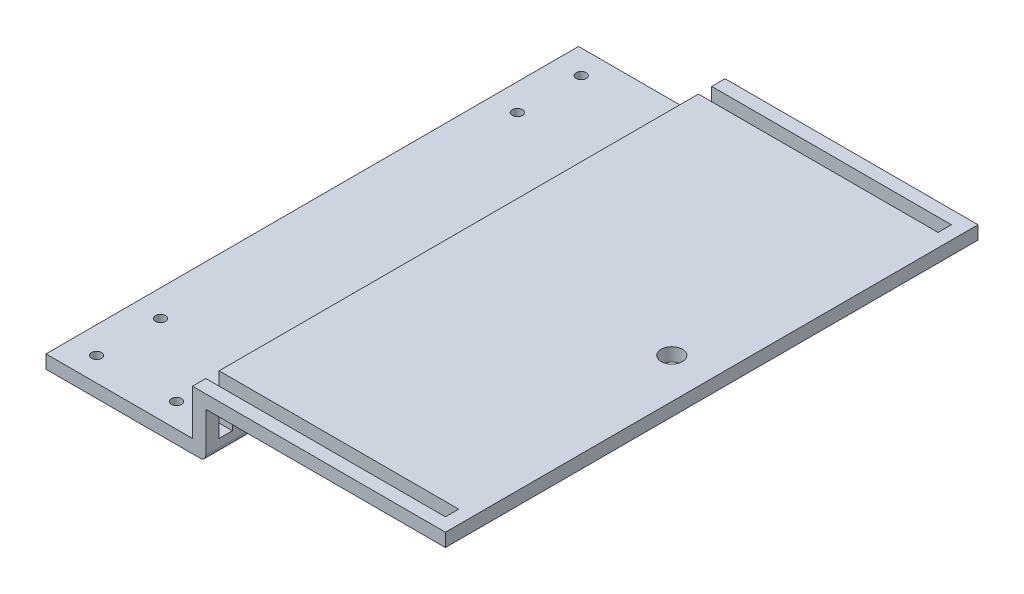
ISO-10303-21;
HEADER;
FILE_DESCRIPTION(('STEP AP214'),'2;1');
FILE_NAME('part.step','',(''),(''),'','','');
FILE_SCHEMA(('AUTOMOTIVE_DESIGN { 1 0 10303 214 1 1 1 1 }'));
ENDSEC;
DATA;
#1=APPLICATION_CONTEXT('core data for automotive mechanical design processes');
#2=APPLICATION_PROTOCOL_DEFINITION('international standard','automotive_design',2000,#1);
#3=PRODUCT_CONTEXT('',#1,'mechanical');
#4=PRODUCT('Part','Part','',(#3));
#5=PRODUCT_RELATED_PRODUCT_CATEGORY('part','',(#4));
#6=PRODUCT_DEFINITION_FORMATION('','',#4);
#7=PRODUCT_DEFINITION_CONTEXT('part definition',#1,'design');
#8=PRODUCT_DEFINITION('design','',#6,#7);
#9=PRODUCT_DEFINITION_SHAPE('','',#8);
#10=(LENGTH_UNIT() NAMED_UNIT(*) SI_UNIT(.MILLI.,.METRE.));
#11=(NAMED_UNIT(*) PLANE_ANGLE_UNIT() SI_UNIT($,.RADIAN.));
#12=(NAMED_UNIT(*) SI_UNIT($,.STERADIAN.) SOLID_ANGLE_UNIT());
#13=UNCERTAINTY_MEASURE_WITH_UNIT(LENGTH_MEASURE(1.E-05),#10,'distance_accuracy_value','');
#14=(GEOMETRIC_REPRESENTATION_CONTEXT(3) GLOBAL_UNCERTAINTY_ASSIGNED_CONTEXT((#13)) GLOBAL_UNIT_ASSIGNED_CONTEXT((#10,
#11,#12)) REPRESENTATION_CONTEXT('',''));
#15=CARTESIAN_POINT('',(0.,0.,0.));
#16=DIRECTION('',(0.,0.,1.));
#17=DIRECTION('',(1.,0.,0.));
#18=AXIS2_PLACEMENT_3D('',#15,#16,#17);
#19=CARTESIAN_POINT('',(-75.,100.,-100.));
#20=DIRECTION('',(0.,0.,1.));
#21=DIRECTION('',(1.,0.,0.));
#22=AXIS2_PLACEMENT_3D('',#19,#20,#21);
#23=PLANE('',#22);
#24=DIRECTION('',(0.,1.,0.));
#25=VECTOR('',#24,1.);
#26=CARTESIAN_POINT('',(-15.,0.,-100.));
#27=LINE('',#26,#25);
#28=CARTESIAN_POINT('',(-15.,2.,-100.));
#29=VERTEX_POINT('',#28);
#30=CARTESIAN_POINT('',(-15.,17.,-100.));
#31=VERTEX_POINT('',#30);
#32=EDGE_CURVE('E546',#29,#31,#27,.T.);
#33=ORIENTED_EDGE('',*,*,#32,.F.);
#34=CARTESIAN_POINT('',(-17.,2.,-100.));
#35=DIRECTION('',(0.,0.,1.));
#36=DIRECTION('',(1.,0.,0.));
#37=AXIS2_PLACEMENT_3D('',#34,#35,#36);
#38=CIRCLE('',#37,2.);
#39=CARTESIAN_POINT('',(-17.,0.,-100.));
#40=VERTEX_POINT('',#39);
#41=EDGE_CURVE('E195',#29,#40,#38,.F.);
#42=ORIENTED_EDGE('',*,*,#41,.T.);
#43=DIRECTION('',(-1.,0.,0.));
#44=VECTOR('',#43,1.);
#45=CARTESIAN_POINT('',(-75.,0.,-100.));
#46=LINE('',#45,#44);
#47=CARTESIAN_POINT('',(-75.,0.,-100.));
#48=VERTEX_POINT('',#47);
#49=EDGE_CURVE('E606',#40,#48,#46,.T.);
#50=ORIENTED_EDGE('',*,*,#49,.T.);
#51=DIRECTION('',(0.,-1.,0.));
#52=VECTOR('',#51,1.);
#53=CARTESIAN_POINT('',(-75.,100.,-100.));
#54=LINE('',#53,#52);
#55=CARTESIAN_POINT('',(-75.,5.,-100.));
#56=VERTEX_POINT('',#55);
#57=EDGE_CURVE('E360',#56,#48,#54,.T.);
#58=ORIENTED_EDGE('',*,*,#57,.F.);
#59=DIRECTION('',(-1.,0.,0.));
#60=VECTOR('',#59,1.);
#61=CARTESIAN_POINT('',(-75.,5.,-100.));
#62=LINE('',#61,#60);
#63=CARTESIAN_POINT('',(-20.,5.,-100.));
#64=VERTEX_POINT('',#63);
#65=EDGE_CURVE('E383',#64,#56,#62,.T.);
#66=ORIENTED_EDGE('',*,*,#65,.F.);
#67=DIRECTION('',(0.,1.,0.));
#68=VECTOR('',#67,1.);
#69=CARTESIAN_POINT('',(-20.,0.,-100.));
#70=LINE('',#69,#68);
#71=CARTESIAN_POINT('',(-20.,22.,-100.));
#72=VERTEX_POINT('',#71);
#73=EDGE_CURVE('E333',#64,#72,#70,.T.);
#74=ORIENTED_EDGE('',*,*,#73,.T.);
#75=DIRECTION('',(-1.,0.,0.));
#76=VECTOR('',#75,1.);
#77=CARTESIAN_POINT('',(0.,22.,-100.));
#78=LINE('',#77,#76);
#79=CARTESIAN_POINT('',(75.,22.,-100.));
#80=VERTEX_POINT('',#79);
#81=EDGE_CURVE('E321',#80,#72,#78,.T.);
#82=ORIENTED_EDGE('',*,*,#81,.F.);
#83=DIRECTION('',(0.,-1.,0.));
#84=VECTOR('',#83,1.);
#85=CARTESIAN_POINT('',(75.,100.,-100.));
#86=LINE('',#85,#84);
#87=CARTESIAN_POINT('',(75.,17.,-100.));
#88=VERTEX_POINT('',#87);
#89=EDGE_CURVE('E329',#80,#88,#86,.T.);
#90=ORIENTED_EDGE('',*,*,#89,.T.);
#91=DIRECTION('',(-1.,0.,0.));
#92=VECTOR('',#91,1.);
#93=CARTESIAN_POINT('',(0.,17.,-100.));
#94=LINE('',#93,#92);
#95=EDGE_CURVE('E340',#88,#31,#94,.T.);
#96=ORIENTED_EDGE('',*,*,#95,.T.);
#97=EDGE_LOOP('',(#33,#42,#50,#58,#66,#74,#82,#90,#96));
#98=FACE_BOUND('',#97,.T.);
#99=ADVANCED_FACE('F168',(#98),#23,.F.);
#100=CARTESIAN_POINT('',(70.,100.,-100.));
#101=DIRECTION('',(-1.,0.,0.));
#102=DIRECTION('',(0.,0.,1.));
#103=AXIS2_PLACEMENT_3D('',#100,#101,#102);
#104=PLANE('',#103);
#105=DIRECTION('',(0.,1.,0.));
#106=VECTOR('',#105,1.);
#107=CARTESIAN_POINT('',(70.,-135.089257261219,95.));
#108=LINE('',#107,#106);
#109=CARTESIAN_POINT('',(70.,16.9999999999999,95.));
#110=VERTEX_POINT('',#109);
#111=CARTESIAN_POINT('',(70.,22.,95.));
#112=VERTEX_POINT('',#111);
#113=EDGE_CURVE('E497',#110,#112,#108,.T.);
#114=ORIENTED_EDGE('',*,*,#113,.T.);
#115=DIRECTION('',(0.,0.,-1.));
#116=VECTOR('',#115,1.);
#117=CARTESIAN_POINT('',(70.,22.,-100.));
#118=LINE('',#117,#116);
#119=CARTESIAN_POINT('',(70.,22.,90.));
#120=VERTEX_POINT('',#119);
#121=EDGE_CURVE('E673',#112,#120,#118,.T.);
#122=ORIENTED_EDGE('',*,*,#121,.T.);
#123=DIRECTION('',(0.,1.,0.));
#124=VECTOR('',#123,1.);
#125=CARTESIAN_POINT('',(70.,-135.089257261219,90.));
#126=LINE('',#125,#124);
#127=CARTESIAN_POINT('',(70.,16.9999999999999,90.));
#128=VERTEX_POINT('',#127);
#129=EDGE_CURVE('E506',#128,#120,#126,.T.);
#130=ORIENTED_EDGE('',*,*,#129,.F.);
#131=DIRECTION('',(0.,0.,-1.));
#132=VECTOR('',#131,1.);
#133=CARTESIAN_POINT('',(70.,17.,-100.));
#134=LINE('',#133,#132);
#135=EDGE_CURVE('E415',#110,#128,#134,.T.);
#136=ORIENTED_EDGE('',*,*,#135,.F.);
#137=EDGE_LOOP('',(#114,#122,#130,#136));
#138=FACE_BOUND('',#137,.T.);
#139=ADVANCED_FACE('F714',(#138),#104,.T.);
#140=DIRECTION('',(0.,1.,0.));
#141=VECTOR('',#140,1.);
#142=CARTESIAN_POINT('',(70.,-135.089257261219,-90.));
#143=LINE('',#142,#141);
#144=CARTESIAN_POINT('',(70.,16.9999999999999,-90.));
#145=VERTEX_POINT('',#144);
#146=CARTESIAN_POINT('',(70.,22.,-90.));
#147=VERTEX_POINT('',#146);
#148=EDGE_CURVE('E656',#145,#147,#143,.T.);
#149=ORIENTED_EDGE('',*,*,#148,.T.);
#150=CARTESIAN_POINT('',(70.,22.,-95.));
#151=VERTEX_POINT('',#150);
#152=EDGE_CURVE('E347',#147,#151,#118,.T.);
#153=ORIENTED_EDGE('',*,*,#152,.T.);
#154=DIRECTION('',(0.,1.,0.));
#155=VECTOR('',#154,1.);
#156=CARTESIAN_POINT('',(70.,-135.089257261219,-95.));
#157=LINE('',#156,#155);
#158=CARTESIAN_POINT('',(70.,16.9999999999999,-95.));
#159=VERTEX_POINT('',#158);
#160=EDGE_CURVE('E659',#159,#151,#157,.T.);
#161=ORIENTED_EDGE('',*,*,#160,.F.);
#162=DIRECTION('',(0.,0.,1.));
#163=VECTOR('',#162,1.);
#164=CARTESIAN_POINT('',(70.,17.,-100.));
#165=LINE('',#164,#163);
#166=EDGE_CURVE('E429',#159,#145,#165,.T.);
#167=ORIENTED_EDGE('',*,*,#166,.T.);
#168=EDGE_LOOP('',(#149,#153,#161,#167));
#169=FACE_BOUND('',#168,.T.);
#170=ADVANCED_FACE('F679',(#169),#104,.T.);
#171=CARTESIAN_POINT('',(75.,100.,-100.));
#172=DIRECTION('',(-1.,0.,0.));
#173=DIRECTION('',(0.,0.,1.));
#174=AXIS2_PLACEMENT_3D('',#171,#172,#173);
#175=PLANE('',#174);
#176=DIRECTION('',(0.,0.,-1.));
#177=VECTOR('',#176,1.);
#178=CARTESIAN_POINT('',(75.,22.,-100.));
#179=LINE('',#178,#177);
#180=CARTESIAN_POINT('',(75.,22.,100.));
#181=VERTEX_POINT('',#180);
#182=EDGE_CURVE('E337',#181,#80,#179,.T.);
#183=ORIENTED_EDGE('',*,*,#182,.F.);
#184=DIRECTION('',(0.,-1.,0.));
#185=VECTOR('',#184,1.);
#186=CARTESIAN_POINT('',(75.,100.,100.));
#187=LINE('',#186,#185);
#188=CARTESIAN_POINT('',(75.,17.,100.));
#189=VERTEX_POINT('',#188);
#190=EDGE_CURVE('E619',#181,#189,#187,.T.);
#191=ORIENTED_EDGE('',*,*,#190,.T.);
#192=DIRECTION('',(0.,0.,-1.));
#193=VECTOR('',#192,1.);
#194=CARTESIAN_POINT('',(75.,17.,-100.));
#195=LINE('',#194,#193);
#196=EDGE_CURVE('E353',#189,#88,#195,.T.);
#197=ORIENTED_EDGE('',*,*,#196,.T.);
#198=ORIENTED_EDGE('',*,*,#89,.F.);
#199=EDGE_LOOP('',(#183,#191,#197,#198));
#200=FACE_BOUND('',#199,.T.);
#201=ADVANCED_FACE('F355',(#200),#175,.F.);
#202=CARTESIAN_POINT('',(-75.,100.,-100.));
#203=DIRECTION('',(1.,0.,0.));
#204=DIRECTION('',(0.,0.,-1.));
#205=AXIS2_PLACEMENT_3D('',#202,#203,#204);
#206=PLANE('',#205);
#207=DIRECTION('',(0.,0.,1.));
#208=VECTOR('',#207,1.);
#209=CARTESIAN_POINT('',(-75.,5.,-100.));
#210=LINE('',#209,#208);
#211=CARTESIAN_POINT('',(-75.,5.,100.));
#212=VERTEX_POINT('',#211);
#213=EDGE_CURVE('E664',#56,#212,#210,.T.);
#214=ORIENTED_EDGE('',*,*,#213,.F.);
#215=ORIENTED_EDGE('',*,*,#57,.T.);
#216=DIRECTION('',(0.,0.,1.));
#217=VECTOR('',#216,1.);
#218=CARTESIAN_POINT('',(-75.,0.,-100.));
#219=LINE('',#218,#217);
#220=CARTESIAN_POINT('',(-75.,0.,100.));
#221=VERTEX_POINT('',#220);
#222=EDGE_CURVE('E612',#48,#221,#219,.T.);
#223=ORIENTED_EDGE('',*,*,#222,.T.);
#224=DIRECTION('',(0.,-1.,0.));
#225=VECTOR('',#224,1.);
#226=CARTESIAN_POINT('',(-75.,100.,100.));
#227=LINE('',#226,#225);
#228=EDGE_CURVE('E361',#212,#221,#227,.T.);
#229=ORIENTED_EDGE('',*,*,#228,.F.);
#230=EDGE_LOOP('',(#214,#215,#223,#229));
#231=FACE_BOUND('',#230,.T.);
#232=ADVANCED_FACE('F633',(#231),#206,.F.);
#233=CARTESIAN_POINT('',(-15.,0.,-100.));
#234=DIRECTION('',(1.,0.,0.));
#235=DIRECTION('',(0.,0.,-1.));
#236=AXIS2_PLACEMENT_3D('',#233,#234,#235);
#237=PLANE('',#236);
#238=DIRECTION('',(0.,1.,0.));
#239=VECTOR('',#238,1.);
#240=CARTESIAN_POINT('',(-15.,0.,-90.));
#241=LINE('',#240,#239);
#242=CARTESIAN_POINT('',(-15.,5.,-90.));
#243=VERTEX_POINT('',#242);
#244=CARTESIAN_POINT('',(-15.,15.,-90.));
#245=VERTEX_POINT('',#244);
#246=EDGE_CURVE('E488',#243,#245,#241,.T.);
#247=ORIENTED_EDGE('',*,*,#246,.T.);
#248=DIRECTION('',(0.,0.,1.));
#249=VECTOR('',#248,1.);
#250=CARTESIAN_POINT('',(-15.,15.,-100.));
#251=LINE('',#250,#249);
#252=CARTESIAN_POINT('',(-15.,15.,90.));
#253=VERTEX_POINT('',#252);
#254=EDGE_CURVE('E443',#245,#253,#251,.T.);
#255=ORIENTED_EDGE('',*,*,#254,.T.);
#256=DIRECTION('',(0.,1.,0.));
#257=VECTOR('',#256,1.);
#258=CARTESIAN_POINT('',(-15.,0.,90.));
#259=LINE('',#258,#257);
#260=CARTESIAN_POINT('',(-15.,5.,90.));
#261=VERTEX_POINT('',#260);
#262=EDGE_CURVE('E475',#261,#253,#259,.T.);
#263=ORIENTED_EDGE('',*,*,#262,.F.);
#264=DIRECTION('',(0.,0.,1.));
#265=VECTOR('',#264,1.);
#266=CARTESIAN_POINT('',(-15.,5.,-100.));
#267=LINE('',#266,#265);
#268=CARTESIAN_POINT('',(-15.,5.,95.));
#269=VERTEX_POINT('',#268);
#270=EDGE_CURVE('E417',#261,#269,#267,.T.);
#271=ORIENTED_EDGE('',*,*,#270,.T.);
#272=DIRECTION('',(0.,1.,0.));
#273=VECTOR('',#272,1.);
#274=CARTESIAN_POINT('',(-15.,0.,95.));
#275=LINE('',#274,#273);
#276=CARTESIAN_POINT('',(-15.,17.,95.));
#277=VERTEX_POINT('',#276);
#278=EDGE_CURVE('E527',#269,#277,#275,.T.);
#279=ORIENTED_EDGE('',*,*,#278,.T.);
#280=DIRECTION('',(0.,0.,1.));
#281=VECTOR('',#280,1.);
#282=CARTESIAN_POINT('',(-15.,17.,-100.));
#283=LINE('',#282,#281);
#284=CARTESIAN_POINT('',(-15.,17.,100.));
#285=VERTEX_POINT('',#284);
#286=EDGE_CURVE('E338',#277,#285,#283,.T.);
#287=ORIENTED_EDGE('',*,*,#286,.T.);
#288=DIRECTION('',(0.,1.,0.));
#289=VECTOR('',#288,1.);
#290=CARTESIAN_POINT('',(-15.,0.,100.));
#291=LINE('',#290,#289);
#292=CARTESIAN_POINT('',(-15.,2.,100.));
#293=VERTEX_POINT('',#292);
#294=EDGE_CURVE('E558',#293,#285,#291,.T.);
#295=ORIENTED_EDGE('',*,*,#294,.F.);
#296=DIRECTION('',(0.,0.,1.));
#297=VECTOR('',#296,1.);
#298=CARTESIAN_POINT('',(-15.,2.,-100.));
#299=LINE('',#298,#297);
#300=EDGE_CURVE('E438',#293,#29,#299,.F.);
#301=ORIENTED_EDGE('',*,*,#300,.T.);
#302=ORIENTED_EDGE('',*,*,#32,.T.);
#303=CARTESIAN_POINT('',(-15.,17.,-95.));
#304=VERTEX_POINT('',#303);
#305=EDGE_CURVE('E571',#31,#304,#283,.T.);
#306=ORIENTED_EDGE('',*,*,#305,.T.);
#307=DIRECTION('',(0.,1.,0.));
#308=VECTOR('',#307,1.);
#309=CARTESIAN_POINT('',(-15.,0.,-95.));
#310=LINE('',#309,#308);
#311=CARTESIAN_POINT('',(-15.,5.,-95.));
#312=VERTEX_POINT('',#311);
#313=EDGE_CURVE('E641',#312,#304,#310,.T.);
#314=ORIENTED_EDGE('',*,*,#313,.F.);
#315=DIRECTION('',(0.,0.,1.));
#316=VECTOR('',#315,1.);
#317=CARTESIAN_POINT('',(-15.,5.,-100.));
#318=LINE('',#317,#316);
#319=EDGE_CURVE('E492',#312,#243,#318,.T.);
#320=ORIENTED_EDGE('',*,*,#319,.T.);
#321=EDGE_LOOP('',(#247,#255,#263,#271,#279,#287,#295,#301,#302,#306,#314,#320));
#322=FACE_BOUND('',#321,.T.);
#323=ADVANCED_FACE('F495',(#322),#237,.T.);
#324=CARTESIAN_POINT('',(0.,17.,-100.));
#325=DIRECTION('',(0.,1.,0.));
#326=DIRECTION('',(-1.,0.,0.));
#327=AXIS2_PLACEMENT_3D('',#324,#325,#326);
#328=PLANE('',#327);
#329=CARTESIAN_POINT('',(60.,17.,0.));
#330=DIRECTION('',(0.,-1.,0.));
#331=DIRECTION('',(1.,0.,0.));
#332=AXIS2_PLACEMENT_3D('',#329,#330,#331);
#333=CIRCLE('',#332,4.00000000000001);
#334=CARTESIAN_POINT('',(64.,17.,0.));
#335=VERTEX_POINT('',#334);
#336=EDGE_CURVE('E540',#335,#335,#333,.T.);
#337=ORIENTED_EDGE('',*,*,#336,.F.);
#338=EDGE_LOOP('',(#337));
#339=FACE_BOUND('',#338,.T.);
#340=DIRECTION('',(-1.,0.,0.));
#341=VECTOR('',#340,1.);
#342=CARTESIAN_POINT('',(0.,17.,90.));
#343=LINE('',#342,#341);
#344=CARTESIAN_POINT('',(-13.,17.,90.));
#345=VERTEX_POINT('',#344);
#346=EDGE_CURVE('E406',#128,#345,#343,.T.);
#347=ORIENTED_EDGE('',*,*,#346,.T.);
#348=DIRECTION('',(0.,0.,1.));
#349=VECTOR('',#348,1.);
#350=CARTESIAN_POINT('',(-13.,17.,-100.));
#351=LINE('',#350,#349);
#352=CARTESIAN_POINT('',(-13.,17.,-90.));
#353=VERTEX_POINT('',#352);
#354=EDGE_CURVE('E450',#345,#353,#351,.F.);
#355=ORIENTED_EDGE('',*,*,#354,.T.);
#356=DIRECTION('',(-1.,0.,0.));
#357=VECTOR('',#356,1.);
#358=CARTESIAN_POINT('',(0.,17.,-90.));
#359=LINE('',#358,#357);
#360=EDGE_CURVE('E489',#145,#353,#359,.T.);
#361=ORIENTED_EDGE('',*,*,#360,.F.);
#362=ORIENTED_EDGE('',*,*,#166,.F.);
#363=DIRECTION('',(-1.,0.,0.));
#364=VECTOR('',#363,1.);
#365=CARTESIAN_POINT('',(0.,17.,-95.));
#366=LINE('',#365,#364);
#367=EDGE_CURVE('E637',#159,#304,#366,.T.);
#368=ORIENTED_EDGE('',*,*,#367,.T.);
#369=ORIENTED_EDGE('',*,*,#305,.F.);
#370=ORIENTED_EDGE('',*,*,#95,.F.);
#371=ORIENTED_EDGE('',*,*,#196,.F.);
#372=DIRECTION('',(-1.,0.,0.));
#373=VECTOR('',#372,1.);
#374=CARTESIAN_POINT('',(0.,17.,100.));
#375=LINE('',#374,#373);
#376=EDGE_CURVE('E560',#189,#285,#375,.T.);
#377=ORIENTED_EDGE('',*,*,#376,.T.);
#378=ORIENTED_EDGE('',*,*,#286,.F.);
#379=DIRECTION('',(-1.,0.,0.));
#380=VECTOR('',#379,1.);
#381=CARTESIAN_POINT('',(0.,17.,95.));
#382=LINE('',#381,#380);
#383=EDGE_CURVE('E416',#110,#277,#382,.T.);
#384=ORIENTED_EDGE('',*,*,#383,.F.);
#385=ORIENTED_EDGE('',*,*,#135,.T.);
#386=EDGE_LOOP('',(#347,#355,#361,#362,#368,#369,#370,#371,#377,#378,#384,#385));
#387=FACE_BOUND('',#386,.T.);
#388=ADVANCED_FACE('F479',(#339,#387),#328,.F.);
#389=CARTESIAN_POINT('',(-20.,0.,-100.));
#390=DIRECTION('',(1.,0.,0.));
#391=DIRECTION('',(0.,0.,-1.));
#392=AXIS2_PLACEMENT_3D('',#389,#390,#391);
#393=PLANE('',#392);
#394=DIRECTION('',(0.,1.,0.));
#395=VECTOR('',#394,1.);
#396=CARTESIAN_POINT('',(-20.,0.,-90.));
#397=LINE('',#396,#395);
#398=CARTESIAN_POINT('',(-20.,7.,-90.));
#399=VERTEX_POINT('',#398);
#400=CARTESIAN_POINT('',(-20.,22.,-90.));
#401=VERTEX_POINT('',#400);
#402=EDGE_CURVE('E430',#399,#401,#397,.T.);
#403=ORIENTED_EDGE('',*,*,#402,.F.);
#404=DIRECTION('',(0.,0.,-1.));
#405=VECTOR('',#404,1.);
#406=CARTESIAN_POINT('',(-20.,7.,-100.));
#407=LINE('',#406,#405);
#408=CARTESIAN_POINT('',(-20.,7.,90.));
#409=VERTEX_POINT('',#408);
#410=EDGE_CURVE('E440',#399,#409,#407,.F.);
#411=ORIENTED_EDGE('',*,*,#410,.T.);
#412=DIRECTION('',(0.,1.,0.));
#413=VECTOR('',#412,1.);
#414=CARTESIAN_POINT('',(-20.,0.,90.));
#415=LINE('',#414,#413);
#416=CARTESIAN_POINT('',(-20.,22.,90.));
#417=VERTEX_POINT('',#416);
#418=EDGE_CURVE('E516',#409,#417,#415,.T.);
#419=ORIENTED_EDGE('',*,*,#418,.T.);
#420=DIRECTION('',(0.,0.,1.));
#421=VECTOR('',#420,1.);
#422=CARTESIAN_POINT('',(-20.,22.,-100.));
#423=LINE('',#422,#421);
#424=EDGE_CURVE('E567',#401,#417,#423,.T.);
#425=ORIENTED_EDGE('',*,*,#424,.F.);
#426=EDGE_LOOP('',(#403,#411,#419,#425));
#427=FACE_BOUND('',#426,.T.);
#428=ADVANCED_FACE('F698',(#427),#393,.F.);
#429=DIRECTION('',(0.,1.,0.));
#430=VECTOR('',#429,1.);
#431=CARTESIAN_POINT('',(-20.,0.,95.));
#432=LINE('',#431,#430);
#433=CARTESIAN_POINT('',(-20.,5.,95.));
#434=VERTEX_POINT('',#433);
#435=CARTESIAN_POINT('',(-20.,22.,95.));
#436=VERTEX_POINT('',#435);
#437=EDGE_CURVE('E528',#434,#436,#432,.T.);
#438=ORIENTED_EDGE('',*,*,#437,.F.);
#439=DIRECTION('',(0.,0.,-1.));
#440=VECTOR('',#439,1.);
#441=CARTESIAN_POINT('',(-20.,5.,0.));
#442=LINE('',#441,#440);
#443=CARTESIAN_POINT('',(-20.,5.,100.));
#444=VERTEX_POINT('',#443);
#445=EDGE_CURVE('E362',#444,#434,#442,.T.);
#446=ORIENTED_EDGE('',*,*,#445,.F.);
#447=DIRECTION('',(0.,1.,0.));
#448=VECTOR('',#447,1.);
#449=CARTESIAN_POINT('',(-20.,0.,100.));
#450=LINE('',#449,#448);
#451=CARTESIAN_POINT('',(-20.,22.,100.));
#452=VERTEX_POINT('',#451);
#453=EDGE_CURVE('E541',#444,#452,#450,.T.);
#454=ORIENTED_EDGE('',*,*,#453,.T.);
#455=EDGE_CURVE('E569',#436,#452,#423,.T.);
#456=ORIENTED_EDGE('',*,*,#455,.F.);
#457=EDGE_LOOP('',(#438,#446,#454,#456));
#458=FACE_BOUND('',#457,.T.);
#459=ADVANCED_FACE('F706',(#458),#393,.F.);
#460=CARTESIAN_POINT('',(-75.,100.,100.));
#461=DIRECTION('',(0.,0.,-1.));
#462=DIRECTION('',(-1.,0.,0.));
#463=AXIS2_PLACEMENT_3D('',#460,#461,#462);
#464=PLANE('',#463);
#465=DIRECTION('',(1.,0.,0.));
#466=VECTOR('',#465,1.);
#467=CARTESIAN_POINT('',(-75.,0.,100.));
#468=LINE('',#467,#466);
#469=CARTESIAN_POINT('',(-17.,0.,100.));
#470=VERTEX_POINT('',#469);
#471=EDGE_CURVE('E613',#221,#470,#468,.T.);
#472=ORIENTED_EDGE('',*,*,#471,.T.);
#473=CARTESIAN_POINT('',(-17.,2.,100.));
#474=DIRECTION('',(0.,0.,-1.));
#475=DIRECTION('',(-1.,0.,0.));
#476=AXIS2_PLACEMENT_3D('',#473,#474,#475);
#477=CIRCLE('',#476,2.);
#478=EDGE_CURVE('E185',#470,#293,#477,.F.);
#479=ORIENTED_EDGE('',*,*,#478,.T.);
#480=ORIENTED_EDGE('',*,*,#294,.T.);
#481=ORIENTED_EDGE('',*,*,#376,.F.);
#482=ORIENTED_EDGE('',*,*,#190,.F.);
#483=DIRECTION('',(-1.,0.,0.));
#484=VECTOR('',#483,1.);
#485=CARTESIAN_POINT('',(0.,22.,100.));
#486=LINE('',#485,#484);
#487=EDGE_CURVE('E344',#181,#452,#486,.T.);
#488=ORIENTED_EDGE('',*,*,#487,.T.);
#489=ORIENTED_EDGE('',*,*,#453,.F.);
#490=DIRECTION('',(1.,0.,0.));
#491=VECTOR('',#490,1.);
#492=CARTESIAN_POINT('',(-75.,5.,100.));
#493=LINE('',#492,#491);
#494=EDGE_CURVE('E603',#212,#444,#493,.T.);
#495=ORIENTED_EDGE('',*,*,#494,.F.);
#496=ORIENTED_EDGE('',*,*,#228,.T.);
#497=EDGE_LOOP('',(#472,#479,#480,#481,#482,#488,#489,#495,#496));
#498=FACE_BOUND('',#497,.T.);
#499=ADVANCED_FACE('F624',(#498),#464,.F.);
#500=CARTESIAN_POINT('',(0.,5.,0.));
#501=DIRECTION('',(0.,1.,0.));
#502=DIRECTION('',(0.,0.,1.));
#503=AXIS2_PLACEMENT_3D('',#500,#501,#502);
#504=PLANE('',#503);
#505=DIRECTION('',(0.,0.,-1.));
#506=VECTOR('',#505,1.);
#507=CARTESIAN_POINT('',(-22.,5.,0.));
#508=LINE('',#507,#506);
#509=CARTESIAN_POINT('',(-22.,5.,90.));
#510=VERTEX_POINT('',#509);
#511=CARTESIAN_POINT('',(-22.,5.,-90.));
#512=VERTEX_POINT('',#511);
#513=EDGE_CURVE('E434',#510,#512,#508,.T.);
#514=ORIENTED_EDGE('',*,*,#513,.T.);
#515=DIRECTION('',(1.,0.,0.));
#516=VECTOR('',#515,1.);
#517=CARTESIAN_POINT('',(0.,5.,-90.));
#518=LINE('',#517,#516);
#519=EDGE_CURVE('E654',#512,#243,#518,.T.);
#520=ORIENTED_EDGE('',*,*,#519,.T.);
#521=ORIENTED_EDGE('',*,*,#319,.F.);
#522=DIRECTION('',(1.,0.,0.));
#523=VECTOR('',#522,1.);
#524=CARTESIAN_POINT('',(0.,5.,-95.));
#525=LINE('',#524,#523);
#526=CARTESIAN_POINT('',(-20.,5.,-95.));
#527=VERTEX_POINT('',#526);
#528=EDGE_CURVE('E653',#527,#312,#525,.T.);
#529=ORIENTED_EDGE('',*,*,#528,.F.);
#530=EDGE_CURVE('E357',#527,#64,#442,.T.);
#531=ORIENTED_EDGE('',*,*,#530,.T.);
#532=ORIENTED_EDGE('',*,*,#65,.T.);
#533=ORIENTED_EDGE('',*,*,#213,.T.);
#534=ORIENTED_EDGE('',*,*,#494,.T.);
#535=ORIENTED_EDGE('',*,*,#445,.T.);
#536=DIRECTION('',(1.,0.,0.));
#537=VECTOR('',#536,1.);
#538=CARTESIAN_POINT('',(0.,5.,95.));
#539=LINE('',#538,#537);
#540=EDGE_CURVE('E509',#434,#269,#539,.T.);
#541=ORIENTED_EDGE('',*,*,#540,.T.);
#542=ORIENTED_EDGE('',*,*,#270,.F.);
#543=DIRECTION('',(1.,0.,0.));
#544=VECTOR('',#543,1.);
#545=CARTESIAN_POINT('',(0.,5.,90.));
#546=LINE('',#545,#544);
#547=EDGE_CURVE('E504',#510,#261,#546,.T.);
#548=ORIENTED_EDGE('',*,*,#547,.F.);
#549=EDGE_LOOP('',(#514,#520,#521,#529,#531,#532,#533,#534,#535,#541,#542,#548));
#550=FACE_BOUND('',#549,.T.);
#551=CARTESIAN_POINT('',(-65.,5.,-91.));
#552=DIRECTION('',(0.,1.,0.));
#553=DIRECTION('',(0.,0.,1.));
#554=AXIS2_PLACEMENT_3D('',#551,#552,#553);
#555=CIRCLE('',#554,1.9);
#556=CARTESIAN_POINT('',(-65.,5.,-89.1));
#557=VERTEX_POINT('',#556);
#558=EDGE_CURVE('E387',#557,#557,#555,.F.);
#559=ORIENTED_EDGE('',*,*,#558,.T.);
#560=EDGE_LOOP('',(#559));
#561=FACE_BOUND('',#560,.T.);
#562=CARTESIAN_POINT('',(-35.,5.,-91.));
#563=DIRECTION('',(0.,1.,0.));
#564=DIRECTION('',(0.,0.,1.));
#565=AXIS2_PLACEMENT_3D('',#562,#563,#564);
#566=CIRCLE('',#565,1.9);
#567=CARTESIAN_POINT('',(-35.,5.,-89.1));
#568=VERTEX_POINT('',#567);
#569=EDGE_CURVE('E399',#568,#568,#566,.F.);
#570=ORIENTED_EDGE('',*,*,#569,.T.);
#571=EDGE_LOOP('',(#570));
#572=FACE_BOUND('',#571,.T.);
#573=CARTESIAN_POINT('',(-65.,5.,91.));
#574=DIRECTION('',(0.,1.,0.));
#575=DIRECTION('',(0.,0.,1.));
#576=AXIS2_PLACEMENT_3D('',#573,#574,#575);
#577=CIRCLE('',#576,1.9);
#578=CARTESIAN_POINT('',(-65.,5.,92.9));
#579=VERTEX_POINT('',#578);
#580=EDGE_CURVE('E368',#579,#579,#577,.T.);
#581=ORIENTED_EDGE('',*,*,#580,.F.);
#582=EDGE_LOOP('',(#581));
#583=FACE_BOUND('',#582,.T.);
#584=CARTESIAN_POINT('',(-35.,5.,91.));
#585=DIRECTION('',(0.,1.,0.));
#586=DIRECTION('',(0.,0.,1.));
#587=AXIS2_PLACEMENT_3D('',#584,#585,#586);
#588=CIRCLE('',#587,1.9);
#589=CARTESIAN_POINT('',(-35.,5.,92.9));
#590=VERTEX_POINT('',#589);
#591=EDGE_CURVE('E382',#590,#590,#588,.T.);
#592=ORIENTED_EDGE('',*,*,#591,.F.);
#593=EDGE_LOOP('',(#592));
#594=FACE_BOUND('',#593,.T.);
#595=CARTESIAN_POINT('',(-65.,5.,-67.));
#596=DIRECTION('',(0.,1.,0.));
#597=DIRECTION('',(0.,0.,1.));
#598=AXIS2_PLACEMENT_3D('',#595,#596,#597);
#599=CIRCLE('',#598,1.9);
#600=CARTESIAN_POINT('',(-65.,5.,-65.1));
#601=VERTEX_POINT('',#600);
#602=EDGE_CURVE('E391',#601,#601,#599,.F.);
#603=ORIENTED_EDGE('',*,*,#602,.T.);
#604=EDGE_LOOP('',(#603));
#605=FACE_BOUND('',#604,.T.);
#606=CARTESIAN_POINT('',(-35.,5.,-67.));
#607=DIRECTION('',(0.,1.,0.));
#608=DIRECTION('',(0.,0.,1.));
#609=AXIS2_PLACEMENT_3D('',#606,#607,#608);
#610=CIRCLE('',#609,1.9);
#611=CARTESIAN_POINT('',(-35.,5.,-65.1));
#612=VERTEX_POINT('',#611);
#613=EDGE_CURVE('E388',#612,#612,#610,.F.);
#614=ORIENTED_EDGE('',*,*,#613,.T.);
#615=EDGE_LOOP('',(#614));
#616=FACE_BOUND('',#615,.T.);
#617=CARTESIAN_POINT('',(-65.,5.,67.));
#618=DIRECTION('',(0.,1.,0.));
#619=DIRECTION('',(0.,0.,1.));
#620=AXIS2_PLACEMENT_3D('',#617,#618,#619);
#621=CIRCLE('',#620,1.9);
#622=CARTESIAN_POINT('',(-65.,5.,68.9));
#623=VERTEX_POINT('',#622);
#624=EDGE_CURVE('E379',#623,#623,#621,.T.);
#625=ORIENTED_EDGE('',*,*,#624,.F.);
#626=EDGE_LOOP('',(#625));
#627=FACE_BOUND('',#626,.T.);
#628=CARTESIAN_POINT('',(-35.,5.,67.));
#629=DIRECTION('',(0.,1.,0.));
#630=DIRECTION('',(0.,0.,1.));
#631=AXIS2_PLACEMENT_3D('',#628,#629,#630);
#632=CIRCLE('',#631,1.9);
#633=CARTESIAN_POINT('',(-35.,5.,68.9));
#634=VERTEX_POINT('',#633);
#635=EDGE_CURVE('E375',#634,#634,#632,.T.);
#636=ORIENTED_EDGE('',*,*,#635,.F.);
#637=EDGE_LOOP('',(#636));
#638=FACE_BOUND('',#637,.T.);
#639=ADVANCED_FACE('F683',(#550,#561,#572,#583,#594,#605,#616,#627,#638),#504,.T.);
#640=CARTESIAN_POINT('',(0.,0.,0.));
#641=DIRECTION('',(0.,1.,0.));
#642=DIRECTION('',(0.,0.,1.));
#643=AXIS2_PLACEMENT_3D('',#640,#641,#642);
#644=PLANE('',#643);
#645=CARTESIAN_POINT('',(-35.,0.,-91.));
#646=DIRECTION('',(0.,1.,0.));
#647=DIRECTION('',(0.,0.,1.));
#648=AXIS2_PLACEMENT_3D('',#645,#646,#647);
#649=CIRCLE('',#648,1.9);
#650=CARTESIAN_POINT('',(-35.,0.,-89.1));
#651=VERTEX_POINT('',#650);
#652=EDGE_CURVE('E578',#651,#651,#649,.T.);
#653=ORIENTED_EDGE('',*,*,#652,.T.);
#654=EDGE_LOOP('',(#653));
#655=FACE_BOUND('',#654,.T.);
#656=CARTESIAN_POINT('',(-65.,0.,-67.));
#657=DIRECTION('',(0.,1.,0.));
#658=DIRECTION('',(0.,0.,1.));
#659=AXIS2_PLACEMENT_3D('',#656,#657,#658);
#660=CIRCLE('',#659,1.9);
#661=CARTESIAN_POINT('',(-65.,0.,-65.1));
#662=VERTEX_POINT('',#661);
#663=EDGE_CURVE('E577',#662,#662,#660,.T.);
#664=ORIENTED_EDGE('',*,*,#663,.T.);
#665=EDGE_LOOP('',(#664));
#666=FACE_BOUND('',#665,.T.);
#667=CARTESIAN_POINT('',(-35.,0.,-67.));
#668=DIRECTION('',(0.,1.,0.));
#669=DIRECTION('',(0.,0.,1.));
#670=AXIS2_PLACEMENT_3D('',#667,#668,#669);
#671=CIRCLE('',#670,1.9);
#672=CARTESIAN_POINT('',(-35.,0.,-65.1));
#673=VERTEX_POINT('',#672);
#674=EDGE_CURVE('E568',#673,#673,#671,.T.);
#675=ORIENTED_EDGE('',*,*,#674,.T.);
#676=EDGE_LOOP('',(#675));
#677=FACE_BOUND('',#676,.T.);
#678=CARTESIAN_POINT('',(-65.,0.,-91.));
#679=DIRECTION('',(0.,1.,0.));
#680=DIRECTION('',(0.,0.,1.));
#681=AXIS2_PLACEMENT_3D('',#678,#679,#680);
#682=CIRCLE('',#681,1.9);
#683=CARTESIAN_POINT('',(-65.,0.,-89.1));
#684=VERTEX_POINT('',#683);
#685=EDGE_CURVE('E392',#684,#684,#682,.T.);
#686=ORIENTED_EDGE('',*,*,#685,.T.);
#687=EDGE_LOOP('',(#686));
#688=FACE_BOUND('',#687,.T.);
#689=CARTESIAN_POINT('',(-35.,0.,91.));
#690=DIRECTION('',(0.,-1.,0.));
#691=DIRECTION('',(0.,0.,-1.));
#692=AXIS2_PLACEMENT_3D('',#689,#690,#691);
#693=CIRCLE('',#692,1.9);
#694=CARTESIAN_POINT('',(-35.,0.,89.1));
#695=VERTEX_POINT('',#694);
#696=EDGE_CURVE('E593',#695,#695,#693,.T.);
#697=ORIENTED_EDGE('',*,*,#696,.F.);
#698=EDGE_LOOP('',(#697));
#699=FACE_BOUND('',#698,.T.);
#700=CARTESIAN_POINT('',(-65.,0.,67.));
#701=DIRECTION('',(0.,-1.,0.));
#702=DIRECTION('',(0.,0.,-1.));
#703=AXIS2_PLACEMENT_3D('',#700,#701,#702);
#704=CIRCLE('',#703,1.9);
#705=CARTESIAN_POINT('',(-65.,0.,65.1));
#706=VERTEX_POINT('',#705);
#707=EDGE_CURVE('E595',#706,#706,#704,.T.);
#708=ORIENTED_EDGE('',*,*,#707,.F.);
#709=EDGE_LOOP('',(#708));
#710=FACE_BOUND('',#709,.T.);
#711=CARTESIAN_POINT('',(-35.,0.,67.));
#712=DIRECTION('',(0.,-1.,0.));
#713=DIRECTION('',(0.,0.,-1.));
#714=AXIS2_PLACEMENT_3D('',#711,#712,#713);
#715=CIRCLE('',#714,1.9);
#716=CARTESIAN_POINT('',(-35.,0.,65.1));
#717=VERTEX_POINT('',#716);
#718=EDGE_CURVE('E404',#717,#717,#715,.T.);
#719=ORIENTED_EDGE('',*,*,#718,.F.);
#720=EDGE_LOOP('',(#719));
#721=FACE_BOUND('',#720,.T.);
#722=CARTESIAN_POINT('',(-65.,0.,91.));
#723=DIRECTION('',(0.,-1.,0.));
#724=DIRECTION('',(0.,0.,-1.));
#725=AXIS2_PLACEMENT_3D('',#722,#723,#724);
#726=CIRCLE('',#725,1.9);
#727=CARTESIAN_POINT('',(-65.,0.,89.1));
#728=VERTEX_POINT('',#727);
#729=EDGE_CURVE('E371',#728,#728,#726,.T.);
#730=ORIENTED_EDGE('',*,*,#729,.F.);
#731=EDGE_LOOP('',(#730));
#732=FACE_BOUND('',#731,.T.);
#733=ORIENTED_EDGE('',*,*,#49,.F.);
#734=DIRECTION('',(0.,0.,1.));
#735=VECTOR('',#734,1.);
#736=CARTESIAN_POINT('',(-17.,0.,100.));
#737=LINE('',#736,#735);
#738=EDGE_CURVE('E447',#40,#470,#737,.T.);
#739=ORIENTED_EDGE('',*,*,#738,.T.);
#740=ORIENTED_EDGE('',*,*,#471,.F.);
#741=ORIENTED_EDGE('',*,*,#222,.F.);
#742=EDGE_LOOP('',(#733,#739,#740,#741));
#743=FACE_BOUND('',#742,.T.);
#744=ADVANCED_FACE('F635',(#655,#666,#677,#688,#699,#710,#721,#732,#743),#644,.F.);
#745=CARTESIAN_POINT('',(-65.,10.,91.));
#746=DIRECTION('',(0.,-1.,0.));
#747=DIRECTION('',(0.,0.,-1.));
#748=AXIS2_PLACEMENT_3D('',#745,#746,#747);
#749=CYLINDRICAL_SURFACE('',#748,1.9);
#750=ORIENTED_EDGE('',*,*,#580,.T.);
#751=EDGE_LOOP('',(#750));
#752=FACE_BOUND('',#751,.T.);
#753=ORIENTED_EDGE('',*,*,#729,.T.);
#754=EDGE_LOOP('',(#753));
#755=FACE_BOUND('',#754,.T.);
#756=ADVANCED_FACE('F724',(#752,#755),#749,.F.);
#757=CARTESIAN_POINT('',(-35.,10.,67.));
#758=DIRECTION('',(0.,-1.,0.));
#759=DIRECTION('',(0.,0.,-1.));
#760=AXIS2_PLACEMENT_3D('',#757,#758,#759);
#761=CYLINDRICAL_SURFACE('',#760,1.9);
#762=ORIENTED_EDGE('',*,*,#635,.T.);
#763=EDGE_LOOP('',(#762));
#764=FACE_BOUND('',#763,.T.);
#765=ORIENTED_EDGE('',*,*,#718,.T.);
#766=EDGE_LOOP('',(#765));
#767=FACE_BOUND('',#766,.T.);
#768=ADVANCED_FACE('F927',(#764,#767),#761,.F.);
#769=CARTESIAN_POINT('',(-65.,10.,67.));
#770=DIRECTION('',(0.,-1.,0.));
#771=DIRECTION('',(0.,0.,-1.));
#772=AXIS2_PLACEMENT_3D('',#769,#770,#771);
#773=CYLINDRICAL_SURFACE('',#772,1.9);
#774=ORIENTED_EDGE('',*,*,#624,.T.);
#775=EDGE_LOOP('',(#774));
#776=FACE_BOUND('',#775,.T.);
#777=ORIENTED_EDGE('',*,*,#707,.T.);
#778=EDGE_LOOP('',(#777));
#779=FACE_BOUND('',#778,.T.);
#780=ADVANCED_FACE('F940',(#776,#779),#773,.F.);
#781=CARTESIAN_POINT('',(-35.,10.,91.));
#782=DIRECTION('',(0.,-1.,0.));
#783=DIRECTION('',(0.,0.,-1.));
#784=AXIS2_PLACEMENT_3D('',#781,#782,#783);
#785=CYLINDRICAL_SURFACE('',#784,1.9);
#786=ORIENTED_EDGE('',*,*,#591,.T.);
#787=EDGE_LOOP('',(#786));
#788=FACE_BOUND('',#787,.T.);
#789=ORIENTED_EDGE('',*,*,#696,.T.);
#790=EDGE_LOOP('',(#789));
#791=FACE_BOUND('',#790,.T.);
#792=ADVANCED_FACE('F932',(#788,#791),#785,.F.);
#793=CARTESIAN_POINT('',(-65.,10.,-91.));
#794=DIRECTION('',(0.,-1.,0.));
#795=DIRECTION('',(0.,0.,-1.));
#796=AXIS2_PLACEMENT_3D('',#793,#794,#795);
#797=CYLINDRICAL_SURFACE('',#796,1.9);
#798=ORIENTED_EDGE('',*,*,#558,.F.);
#799=EDGE_LOOP('',(#798));
#800=FACE_BOUND('',#799,.T.);
#801=ORIENTED_EDGE('',*,*,#685,.F.);
#802=EDGE_LOOP('',(#801));
#803=FACE_BOUND('',#802,.T.);
#804=ADVANCED_FACE('F938',(#800,#803),#797,.F.);
#805=CARTESIAN_POINT('',(-35.,10.,-67.));
#806=DIRECTION('',(0.,-1.,0.));
#807=DIRECTION('',(0.,0.,-1.));
#808=AXIS2_PLACEMENT_3D('',#805,#806,#807);
#809=CYLINDRICAL_SURFACE('',#808,1.9);
#810=ORIENTED_EDGE('',*,*,#613,.F.);
#811=EDGE_LOOP('',(#810));
#812=FACE_BOUND('',#811,.T.);
#813=ORIENTED_EDGE('',*,*,#674,.F.);
#814=EDGE_LOOP('',(#813));
#815=FACE_BOUND('',#814,.T.);
#816=ADVANCED_FACE('F950',(#812,#815),#809,.F.);
#817=CARTESIAN_POINT('',(-65.,10.,-67.));
#818=DIRECTION('',(0.,-1.,0.));
#819=DIRECTION('',(0.,0.,-1.));
#820=AXIS2_PLACEMENT_3D('',#817,#818,#819);
#821=CYLINDRICAL_SURFACE('',#820,1.9);
#822=ORIENTED_EDGE('',*,*,#602,.F.);
#823=EDGE_LOOP('',(#822));
#824=FACE_BOUND('',#823,.T.);
#825=ORIENTED_EDGE('',*,*,#663,.F.);
#826=EDGE_LOOP('',(#825));
#827=FACE_BOUND('',#826,.T.);
#828=ADVANCED_FACE('F954',(#824,#827),#821,.F.);
#829=CARTESIAN_POINT('',(-35.,10.,-91.));
#830=DIRECTION('',(0.,-1.,0.));
#831=DIRECTION('',(0.,0.,-1.));
#832=AXIS2_PLACEMENT_3D('',#829,#830,#831);
#833=CYLINDRICAL_SURFACE('',#832,1.9);
#834=ORIENTED_EDGE('',*,*,#569,.F.);
#835=EDGE_LOOP('',(#834));
#836=FACE_BOUND('',#835,.T.);
#837=ORIENTED_EDGE('',*,*,#652,.F.);
#838=EDGE_LOOP('',(#837));
#839=FACE_BOUND('',#838,.T.);
#840=ADVANCED_FACE('F767',(#836,#839),#833,.F.);
#841=CARTESIAN_POINT('',(0.,22.,-100.));
#842=DIRECTION('',(0.,1.,0.));
#843=DIRECTION('',(-1.,0.,0.));
#844=AXIS2_PLACEMENT_3D('',#841,#842,#843);
#845=PLANE('',#844);
#846=DIRECTION('',(-1.,0.,0.));
#847=VECTOR('',#846,1.);
#848=CARTESIAN_POINT('',(0.,22.,-95.));
#849=LINE('',#848,#847);
#850=CARTESIAN_POINT('',(-20.,22.,-95.));
#851=VERTEX_POINT('',#850);
#852=EDGE_CURVE('E647',#151,#851,#849,.T.);
#853=ORIENTED_EDGE('',*,*,#852,.F.);
#854=ORIENTED_EDGE('',*,*,#152,.F.);
#855=DIRECTION('',(-1.,0.,0.));
#856=VECTOR('',#855,1.);
#857=CARTESIAN_POINT('',(0.,22.,-90.));
#858=LINE('',#857,#856);
#859=EDGE_CURVE('E501',#147,#401,#858,.T.);
#860=ORIENTED_EDGE('',*,*,#859,.T.);
#861=ORIENTED_EDGE('',*,*,#424,.T.);
#862=DIRECTION('',(-1.,0.,0.));
#863=VECTOR('',#862,1.);
#864=CARTESIAN_POINT('',(0.,22.,90.));
#865=LINE('',#864,#863);
#866=EDGE_CURVE('E521',#120,#417,#865,.T.);
#867=ORIENTED_EDGE('',*,*,#866,.F.);
#868=ORIENTED_EDGE('',*,*,#121,.F.);
#869=DIRECTION('',(-1.,0.,0.));
#870=VECTOR('',#869,1.);
#871=CARTESIAN_POINT('',(0.,22.,95.));
#872=LINE('',#871,#870);
#873=EDGE_CURVE('E531',#112,#436,#872,.T.);
#874=ORIENTED_EDGE('',*,*,#873,.T.);
#875=ORIENTED_EDGE('',*,*,#455,.T.);
#876=ORIENTED_EDGE('',*,*,#487,.F.);
#877=ORIENTED_EDGE('',*,*,#182,.T.);
#878=ORIENTED_EDGE('',*,*,#81,.T.);
#879=EDGE_CURVE('E562',#72,#851,#423,.T.);
#880=ORIENTED_EDGE('',*,*,#879,.T.);
#881=EDGE_LOOP('',(#853,#854,#860,#861,#867,#868,#874,#875,#876,#877,#878,#880));
#882=FACE_BOUND('',#881,.T.);
#883=CARTESIAN_POINT('',(60.,22.,0.));
#884=DIRECTION('',(0.,1.,0.));
#885=DIRECTION('',(-1.,0.,0.));
#886=AXIS2_PLACEMENT_3D('',#883,#884,#885);
#887=CIRCLE('',#886,4.00000000000001);
#888=CARTESIAN_POINT('',(56.,22.,0.));
#889=VERTEX_POINT('',#888);
#890=EDGE_CURVE('E542',#889,#889,#887,.T.);
#891=ORIENTED_EDGE('',*,*,#890,.F.);
#892=EDGE_LOOP('',(#891));
#893=FACE_BOUND('',#892,.T.);
#894=ADVANCED_FACE('F345',(#882,#893),#845,.T.);
#895=ORIENTED_EDGE('',*,*,#530,.F.);
#896=DIRECTION('',(0.,1.,0.));
#897=VECTOR('',#896,1.);
#898=CARTESIAN_POINT('',(-20.,0.,-95.));
#899=LINE('',#898,#897);
#900=EDGE_CURVE('E423',#527,#851,#899,.T.);
#901=ORIENTED_EDGE('',*,*,#900,.T.);
#902=ORIENTED_EDGE('',*,*,#879,.F.);
#903=ORIENTED_EDGE('',*,*,#73,.F.);
#904=EDGE_LOOP('',(#895,#901,#902,#903));
#905=FACE_BOUND('',#904,.T.);
#906=ADVANCED_FACE('F685',(#905),#393,.F.);
#907=CARTESIAN_POINT('',(60.,27.,0.));
#908=DIRECTION('',(0.,-1.,0.));
#909=DIRECTION('',(1.,0.,0.));
#910=AXIS2_PLACEMENT_3D('',#907,#908,#909);
#911=CYLINDRICAL_SURFACE('',#910,4.00000000000001);
#912=ORIENTED_EDGE('',*,*,#890,.T.);
#913=EDGE_LOOP('',(#912));
#914=FACE_BOUND('',#913,.T.);
#915=ORIENTED_EDGE('',*,*,#336,.T.);
#916=EDGE_LOOP('',(#915));
#917=FACE_BOUND('',#916,.T.);
#918=ADVANCED_FACE('F836',(#914,#917),#911,.F.);
#919=CARTESIAN_POINT('',(0.,-135.089257261219,90.));
#920=DIRECTION('',(0.,0.,-1.));
#921=DIRECTION('',(-1.,0.,0.));
#922=AXIS2_PLACEMENT_3D('',#919,#920,#921);
#923=PLANE('',#922);
#924=ORIENTED_EDGE('',*,*,#866,.T.);
#925=ORIENTED_EDGE('',*,*,#418,.F.);
#926=CARTESIAN_POINT('',(-22.,7.,90.));
#927=DIRECTION('',(0.,0.,-1.));
#928=DIRECTION('',(-1.,0.,0.));
#929=AXIS2_PLACEMENT_3D('',#926,#927,#928);
#930=CIRCLE('',#929,2.);
#931=EDGE_CURVE('E458',#409,#510,#930,.T.);
#932=ORIENTED_EDGE('',*,*,#931,.T.);
#933=ORIENTED_EDGE('',*,*,#547,.T.);
#934=ORIENTED_EDGE('',*,*,#262,.T.);
#935=CARTESIAN_POINT('',(-13.,15.,90.));
#936=DIRECTION('',(0.,0.,-1.));
#937=DIRECTION('',(-1.,0.,0.));
#938=AXIS2_PLACEMENT_3D('',#935,#936,#937);
#939=CIRCLE('',#938,2.);
#940=EDGE_CURVE('E179',#253,#345,#939,.T.);
#941=ORIENTED_EDGE('',*,*,#940,.T.);
#942=ORIENTED_EDGE('',*,*,#346,.F.);
#943=ORIENTED_EDGE('',*,*,#129,.T.);
#944=EDGE_LOOP('',(#924,#925,#932,#933,#934,#941,#942,#943));
#945=FACE_BOUND('',#944,.T.);
#946=ADVANCED_FACE('F470',(#945),#923,.F.);
#947=CARTESIAN_POINT('',(0.,-135.089257261219,95.));
#948=DIRECTION('',(0.,0.,-1.));
#949=DIRECTION('',(-1.,0.,0.));
#950=AXIS2_PLACEMENT_3D('',#947,#948,#949);
#951=PLANE('',#950);
#952=ORIENTED_EDGE('',*,*,#113,.F.);
#953=ORIENTED_EDGE('',*,*,#383,.T.);
#954=ORIENTED_EDGE('',*,*,#278,.F.);
#955=ORIENTED_EDGE('',*,*,#540,.F.);
#956=ORIENTED_EDGE('',*,*,#437,.T.);
#957=ORIENTED_EDGE('',*,*,#873,.F.);
#958=EDGE_LOOP('',(#952,#953,#954,#955,#956,#957));
#959=FACE_BOUND('',#958,.T.);
#960=ADVANCED_FACE('F711',(#959),#951,.T.);
#961=CARTESIAN_POINT('',(0.,-135.089257261219,-95.));
#962=DIRECTION('',(0.,0.,-1.));
#963=DIRECTION('',(-1.,0.,0.));
#964=AXIS2_PLACEMENT_3D('',#961,#962,#963);
#965=PLANE('',#964);
#966=ORIENTED_EDGE('',*,*,#313,.T.);
#967=ORIENTED_EDGE('',*,*,#367,.F.);
#968=ORIENTED_EDGE('',*,*,#160,.T.);
#969=ORIENTED_EDGE('',*,*,#852,.T.);
#970=ORIENTED_EDGE('',*,*,#900,.F.);
#971=ORIENTED_EDGE('',*,*,#528,.T.);
#972=EDGE_LOOP('',(#966,#967,#968,#969,#970,#971));
#973=FACE_BOUND('',#972,.T.);
#974=ADVANCED_FACE('F676',(#973),#965,.F.);
#975=CARTESIAN_POINT('',(0.,-135.089257261219,-90.));
#976=DIRECTION('',(0.,0.,-1.));
#977=DIRECTION('',(-1.,0.,0.));
#978=AXIS2_PLACEMENT_3D('',#975,#976,#977);
#979=PLANE('',#978);
#980=ORIENTED_EDGE('',*,*,#519,.F.);
#981=CARTESIAN_POINT('',(-22.,7.,-90.));
#982=DIRECTION('',(0.,0.,-1.));
#983=DIRECTION('',(-1.,0.,0.));
#984=AXIS2_PLACEMENT_3D('',#981,#982,#983);
#985=CIRCLE('',#984,2.);
#986=EDGE_CURVE('E460',#512,#399,#985,.F.);
#987=ORIENTED_EDGE('',*,*,#986,.T.);
#988=ORIENTED_EDGE('',*,*,#402,.T.);
#989=ORIENTED_EDGE('',*,*,#859,.F.);
#990=ORIENTED_EDGE('',*,*,#148,.F.);
#991=ORIENTED_EDGE('',*,*,#360,.T.);
#992=CARTESIAN_POINT('',(-13.,15.,-90.));
#993=DIRECTION('',(0.,0.,-1.));
#994=DIRECTION('',(-1.,0.,0.));
#995=AXIS2_PLACEMENT_3D('',#992,#993,#994);
#996=CIRCLE('',#995,2.);
#997=EDGE_CURVE('E12',#353,#245,#996,.F.);
#998=ORIENTED_EDGE('',*,*,#997,.T.);
#999=ORIENTED_EDGE('',*,*,#246,.F.);
#1000=EDGE_LOOP('',(#980,#987,#988,#989,#990,#991,#998,#999));
#1001=FACE_BOUND('',#1000,.T.);
#1002=ADVANCED_FACE('F484',(#1001),#979,.T.);
#1003=CARTESIAN_POINT('',(-22.,7.,0.));
#1004=DIRECTION('',(0.,0.,-1.));
#1005=DIRECTION('',(-1.,0.,0.));
#1006=AXIS2_PLACEMENT_3D('',#1003,#1004,#1005);
#1007=CYLINDRICAL_SURFACE('',#1006,2.);
#1008=ORIENTED_EDGE('',*,*,#931,.F.);
#1009=ORIENTED_EDGE('',*,*,#410,.F.);
#1010=ORIENTED_EDGE('',*,*,#986,.F.);
#1011=ORIENTED_EDGE('',*,*,#513,.F.);
#1012=EDGE_LOOP('',(#1008,#1009,#1010,#1011));
#1013=FACE_BOUND('',#1012,.T.);
#1014=ADVANCED_FACE('F693',(#1013),#1007,.F.);
#1015=CARTESIAN_POINT('',(-13.,15.,-100.));
#1016=DIRECTION('',(0.,0.,1.));
#1017=DIRECTION('',(1.,0.,0.));
#1018=AXIS2_PLACEMENT_3D('',#1015,#1016,#1017);
#1019=CYLINDRICAL_SURFACE('',#1018,2.);
#1020=ORIENTED_EDGE('',*,*,#997,.F.);
#1021=ORIENTED_EDGE('',*,*,#354,.F.);
#1022=ORIENTED_EDGE('',*,*,#940,.F.);
#1023=ORIENTED_EDGE('',*,*,#254,.F.);
#1024=EDGE_LOOP('',(#1020,#1021,#1022,#1023));
#1025=FACE_BOUND('',#1024,.T.);
#1026=ADVANCED_FACE('F482',(#1025),#1019,.F.);
#1027=CARTESIAN_POINT('',(-17.,2.,0.));
#1028=DIRECTION('',(0.,0.,-1.));
#1029=DIRECTION('',(-1.,0.,0.));
#1030=AXIS2_PLACEMENT_3D('',#1027,#1028,#1029);
#1031=CYLINDRICAL_SURFACE('',#1030,2.);
#1032=ORIENTED_EDGE('',*,*,#41,.F.);
#1033=ORIENTED_EDGE('',*,*,#300,.F.);
#1034=ORIENTED_EDGE('',*,*,#478,.F.);
#1035=ORIENTED_EDGE('',*,*,#738,.F.);
#1036=EDGE_LOOP('',(#1032,#1033,#1034,#1035));
#1037=FACE_BOUND('',#1036,.T.);
#1038=ADVANCED_FACE('F166',(#1037),#1031,.T.);
#1039=CLOSED_SHELL('',(#99,#139,#170,#201,#232,#323,#388,#428,#459,#499,#639,#744,#756,#768,
#780,#792,#804,#816,#828,#840,#894,#906,#918,#946,#960,#974,#1002,#1014,#1026,#1038));
#1040=MANIFOLD_SOLID_BREP('B2',#1039);
#1041=ADVANCED_BREP_SHAPE_REPRESENTATION('',(#18,#1040),#14);
#1042=SHAPE_DEFINITION_REPRESENTATION(#9,#1041);
ENDSEC;
END-ISO-10303-21;
